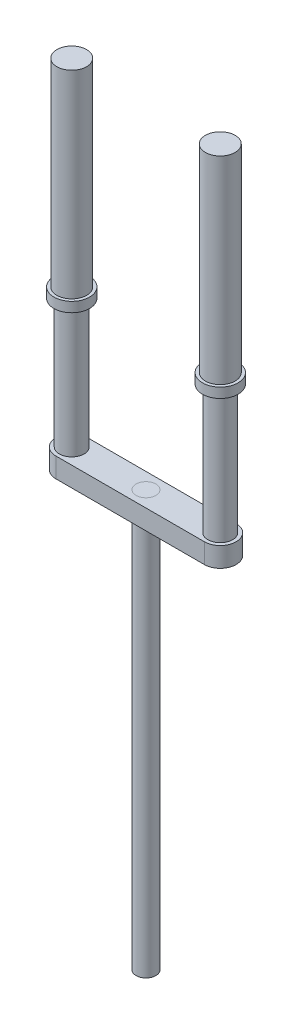
ISO-10303-21;
HEADER;
FILE_DESCRIPTION(('STEP AP214'),'2;1');
FILE_NAME('part.step','',(''),(''),'','','');
FILE_SCHEMA(('AUTOMOTIVE_DESIGN { 1 0 10303 214 1 1 1 1 }'));
ENDSEC;
DATA;
#1=APPLICATION_CONTEXT('core data for automotive mechanical design processes');
#2=APPLICATION_PROTOCOL_DEFINITION('international standard','automotive_design',2000,#1);
#3=PRODUCT_CONTEXT('',#1,'mechanical');
#4=PRODUCT('Part','Part','',(#3));
#5=PRODUCT_RELATED_PRODUCT_CATEGORY('part','',(#4));
#6=PRODUCT_DEFINITION_FORMATION('','',#4);
#7=PRODUCT_DEFINITION_CONTEXT('part definition',#1,'design');
#8=PRODUCT_DEFINITION('design','',#6,#7);
#9=PRODUCT_DEFINITION_SHAPE('','',#8);
#10=(LENGTH_UNIT() NAMED_UNIT(*) SI_UNIT(.MILLI.,.METRE.));
#11=(NAMED_UNIT(*) PLANE_ANGLE_UNIT() SI_UNIT($,.RADIAN.));
#12=(NAMED_UNIT(*) SI_UNIT($,.STERADIAN.) SOLID_ANGLE_UNIT());
#13=UNCERTAINTY_MEASURE_WITH_UNIT(LENGTH_MEASURE(1.E-05),#10,'distance_accuracy_value','');
#14=(GEOMETRIC_REPRESENTATION_CONTEXT(3) GLOBAL_UNCERTAINTY_ASSIGNED_CONTEXT((#13)) GLOBAL_UNIT_ASSIGNED_CONTEXT((#10,
#11,#12)) REPRESENTATION_CONTEXT('',''));
#15=CARTESIAN_POINT('',(0.,0.,0.));
#16=DIRECTION('',(0.,0.,1.));
#17=DIRECTION('',(1.,0.,0.));
#18=AXIS2_PLACEMENT_3D('',#15,#16,#17);
#19=CARTESIAN_POINT('',(0.,20.,0.));
#20=DIRECTION('',(0.,-1.,0.));
#21=DIRECTION('',(0.,0.,-1.));
#22=AXIS2_PLACEMENT_3D('',#19,#20,#21);
#23=CYLINDRICAL_SURFACE('',#22,10.);
#24=CARTESIAN_POINT('',(0.,20.,0.));
#25=DIRECTION('',(0.,1.,0.));
#26=DIRECTION('',(0.,0.,1.));
#27=AXIS2_PLACEMENT_3D('',#24,#25,#26);
#28=CIRCLE('',#27,10.);
#29=CARTESIAN_POINT('',(0.,20.,10.));
#30=VERTEX_POINT('',#29);
#31=EDGE_CURVE('E11',#30,#30,#28,.T.);
#32=ORIENTED_EDGE('',*,*,#31,.F.);
#33=EDGE_LOOP('',(#32));
#34=FACE_BOUND('',#33,.T.);
#35=CARTESIAN_POINT('',(0.,-400.,0.));
#36=DIRECTION('',(0.,1.,0.));
#37=DIRECTION('',(0.,0.,1.));
#38=AXIS2_PLACEMENT_3D('',#35,#36,#37);
#39=CIRCLE('',#38,10.);
#40=CARTESIAN_POINT('',(0.,-400.,10.));
#41=VERTEX_POINT('',#40);
#42=EDGE_CURVE('E55',#41,#41,#39,.T.);
#43=ORIENTED_EDGE('',*,*,#42,.T.);
#44=EDGE_LOOP('',(#43));
#45=FACE_BOUND('',#44,.T.);
#46=ADVANCED_FACE('F49',(#34,#45),#23,.T.);
#47=CARTESIAN_POINT('',(0.,20.,0.));
#48=DIRECTION('',(0.,1.,0.));
#49=DIRECTION('',(0.,0.,1.));
#50=AXIS2_PLACEMENT_3D('',#47,#48,#49);
#51=PLANE('',#50);
#52=ORIENTED_EDGE('',*,*,#31,.T.);
#53=EDGE_LOOP('',(#52));
#54=FACE_BOUND('',#53,.T.);
#55=ADVANCED_FACE('F64',(#54),#51,.T.);
#56=CARTESIAN_POINT('',(0.,-400.,0.));
#57=DIRECTION('',(0.,1.,0.));
#58=DIRECTION('',(0.,0.,1.));
#59=AXIS2_PLACEMENT_3D('',#56,#57,#58);
#60=PLANE('',#59);
#61=ORIENTED_EDGE('',*,*,#42,.F.);
#62=EDGE_LOOP('',(#61));
#63=FACE_BOUND('',#62,.T.);
#64=ADVANCED_FACE('F62',(#63),#60,.F.);
#65=CLOSED_SHELL('',(#46,#55,#64));
#66=MANIFOLD_SOLID_BREP('B2',#65);
#67=CARTESIAN_POINT('',(75.,360.,0.));
#68=DIRECTION('',(0.,-1.,0.));
#69=DIRECTION('',(0.,0.,-1.));
#70=AXIS2_PLACEMENT_3D('',#67,#68,#69);
#71=CYLINDRICAL_SURFACE('',#70,12.5);
#72=CARTESIAN_POINT('',(75.,20.,0.));
#73=DIRECTION('',(0.,1.,0.));
#74=DIRECTION('',(0.,0.,1.));
#75=AXIS2_PLACEMENT_3D('',#72,#73,#74);
#76=CIRCLE('',#75,12.5);
#77=CARTESIAN_POINT('',(75.,20.,-12.5));
#78=VERTEX_POINT('',#77);
#79=EDGE_CURVE('E196',#78,#78,#76,.T.);
#80=CARTESIAN_POINT('',(75.,150.,0.));
#81=DIRECTION('',(0.,1.,0.));
#82=DIRECTION('',(0.,0.,1.));
#83=AXIS2_PLACEMENT_3D('',#80,#81,#82);
#84=CIRCLE('',#83,12.5);
#85=CARTESIAN_POINT('',(75.,150.,-12.5));
#86=VERTEX_POINT('',#85);
#87=EDGE_CURVE('E47',#86,#86,#84,.T.);
#88=CARTESIAN_POINT('',(75.,20.,-12.5));
#89=CARTESIAN_POINT('',(75.,21.3541666666666,-12.5));
#90=CARTESIAN_POINT('',(75.,22.7083333333333,-12.5));
#91=CARTESIAN_POINT('',(75.,25.4166666666666,-12.5));
#92=CARTESIAN_POINT('',(75.,26.7708333333333,-12.5));
#93=CARTESIAN_POINT('',(75.,29.4791666666666,-12.5));
#94=CARTESIAN_POINT('',(75.,30.8333333333333,-12.5));
#95=CARTESIAN_POINT('',(75.,33.5416666666666,-12.5));
#96=CARTESIAN_POINT('',(75.,34.8958333333333,-12.5));
#97=CARTESIAN_POINT('',(75.,37.6041666666666,-12.5));
#98=CARTESIAN_POINT('',(75.,38.9583333333333,-12.5));
#99=CARTESIAN_POINT('',(75.,41.6666666666666,-12.5));
#100=CARTESIAN_POINT('',(75.,43.0208333333333,-12.5));
#101=CARTESIAN_POINT('',(75.,45.7291666666666,-12.5));
#102=CARTESIAN_POINT('',(75.,47.0833333333333,-12.5));
#103=CARTESIAN_POINT('',(75.,49.7916666666666,-12.5));
#104=CARTESIAN_POINT('',(75.,51.1458333333333,-12.5));
#105=CARTESIAN_POINT('',(75.,53.8541666666666,-12.5));
#106=CARTESIAN_POINT('',(75.,55.2083333333333,-12.5));
#107=CARTESIAN_POINT('',(75.,57.9166666666666,-12.5));
#108=CARTESIAN_POINT('',(75.,59.2708333333333,-12.5));
#109=CARTESIAN_POINT('',(75.,61.9791666666666,-12.5));
#110=CARTESIAN_POINT('',(75.,63.3333333333333,-12.5));
#111=CARTESIAN_POINT('',(75.,66.0416666666666,-12.5));
#112=CARTESIAN_POINT('',(75.,67.3958333333333,-12.5));
#113=CARTESIAN_POINT('',(75.,70.1041666666666,-12.5));
#114=CARTESIAN_POINT('',(75.,71.4583333333333,-12.5));
#115=CARTESIAN_POINT('',(75.,74.1666666666666,-12.5));
#116=CARTESIAN_POINT('',(75.,75.5208333333333,-12.5));
#117=CARTESIAN_POINT('',(75.,78.2291666666666,-12.5));
#118=CARTESIAN_POINT('',(75.,79.5833333333333,-12.5));
#119=CARTESIAN_POINT('',(75.,82.2916666666666,-12.5));
#120=CARTESIAN_POINT('',(75.,83.6458333333333,-12.5));
#121=CARTESIAN_POINT('',(75.,86.3541666666666,-12.5));
#122=CARTESIAN_POINT('',(75.,87.7083333333333,-12.5));
#123=CARTESIAN_POINT('',(75.,90.4166666666666,-12.5));
#124=CARTESIAN_POINT('',(75.,91.7708333333333,-12.5));
#125=CARTESIAN_POINT('',(75.,94.4791666666666,-12.5));
#126=CARTESIAN_POINT('',(75.,95.8333333333333,-12.5));
#127=CARTESIAN_POINT('',(75.,98.5416666666666,-12.5));
#128=CARTESIAN_POINT('',(75.,99.8958333333333,-12.5));
#129=CARTESIAN_POINT('',(75.,102.604166666667,-12.5));
#130=CARTESIAN_POINT('',(75.,103.958333333333,-12.5));
#131=CARTESIAN_POINT('',(75.,106.666666666667,-12.5));
#132=CARTESIAN_POINT('',(75.,108.020833333333,-12.5));
#133=CARTESIAN_POINT('',(75.,110.729166666667,-12.5));
#134=CARTESIAN_POINT('',(75.,112.083333333333,-12.5));
#135=CARTESIAN_POINT('',(75.,114.791666666667,-12.5));
#136=CARTESIAN_POINT('',(75.,116.145833333333,-12.5));
#137=CARTESIAN_POINT('',(75.,118.854166666667,-12.5));
#138=CARTESIAN_POINT('',(75.,120.208333333333,-12.5));
#139=CARTESIAN_POINT('',(75.,122.916666666667,-12.5));
#140=CARTESIAN_POINT('',(75.,124.270833333333,-12.5));
#141=CARTESIAN_POINT('',(75.,126.979166666667,-12.5));
#142=CARTESIAN_POINT('',(75.,128.333333333333,-12.5));
#143=CARTESIAN_POINT('',(75.,131.041666666667,-12.5));
#144=CARTESIAN_POINT('',(75.,132.395833333333,-12.5));
#145=CARTESIAN_POINT('',(75.,135.104166666667,-12.5));
#146=CARTESIAN_POINT('',(75.,136.458333333333,-12.5));
#147=CARTESIAN_POINT('',(75.,139.166666666667,-12.5));
#148=CARTESIAN_POINT('',(75.,140.520833333333,-12.5));
#149=CARTESIAN_POINT('',(75.,143.229166666667,-12.5));
#150=CARTESIAN_POINT('',(75.,144.583333333333,-12.5));
#151=CARTESIAN_POINT('',(75.,147.291666666667,-12.5));
#152=CARTESIAN_POINT('',(75.,148.645833333333,-12.5));
#153=CARTESIAN_POINT('',(75.,150.,-12.5));
#154=B_SPLINE_CURVE_WITH_KNOTS('',3,(#88,#89,#90,#91,#92,#93,#94,#95,#96,#97,#98,#99,#100,#101,
#102,#103,#104,#105,#106,#107,#108,#109,#110,#111,#112,#113,#114,#115,#116,#117,#118,#119,#120,
#121,#122,#123,#124,#125,#126,#127,#128,#129,#130,#131,#132,#133,#134,#135,#136,#137,#138,#139,
#140,#141,#142,#143,#144,#145,#146,#147,#148,#149,#150,#151,#152,#153),.UNSPECIFIED.,.F.,.F.,(4,
2,2,2,2,2,2,2,2,2,2,2,2,2,2,2,2,2,2,2,2,2,2,2,2,2,2,2,2,2,2,2,4),(0.,4.06250000000002,
8.12499999999999,12.1875,16.25,20.3125,24.375,28.4375,32.5,36.5625,40.625,44.6875,48.75,52.8125,
56.875,60.9375,65.,69.0625,73.125,77.1875,81.25,85.3125,89.375,93.4375,97.5,101.5625,105.625,
109.6875,113.75,117.8125,121.875,125.9375,130.),.UNSPECIFIED.);
#155=EDGE_CURVE('BSEAM90',#78,#86,#154,.T.);
#156=ORIENTED_EDGE('',*,*,#79,.T.);
#157=ORIENTED_EDGE('',*,*,#87,.F.);
#158=ORIENTED_EDGE('',*,*,#155,.T.);
#159=ORIENTED_EDGE('',*,*,#155,.F.);
#160=EDGE_LOOP('',(#156,#158,#157,#159));
#161=FACE_BOUND('',#160,.T.);
#162=ADVANCED_FACE('F90',(#161),#71,.T.);
#163=CARTESIAN_POINT('',(-75.,360.,0.));
#164=DIRECTION('',(0.,-1.,0.));
#165=DIRECTION('',(0.,0.,-1.));
#166=AXIS2_PLACEMENT_3D('',#163,#164,#165);
#167=CYLINDRICAL_SURFACE('',#166,12.5);
#168=CARTESIAN_POINT('',(-75.,150.,0.));
#169=DIRECTION('',(0.,-1.,0.));
#170=DIRECTION('',(0.,0.,-1.));
#171=AXIS2_PLACEMENT_3D('',#168,#169,#170);
#172=CIRCLE('',#171,12.5);
#173=CARTESIAN_POINT('',(-75.,150.,-12.5));
#174=VERTEX_POINT('',#173);
#175=EDGE_CURVE('E100',#174,#174,#172,.F.);
#176=CARTESIAN_POINT('',(-75.,20.,0.));
#177=DIRECTION('',(0.,1.,0.));
#178=DIRECTION('',(0.,0.,-1.));
#179=AXIS2_PLACEMENT_3D('',#176,#177,#178);
#180=CIRCLE('',#179,12.5);
#181=CARTESIAN_POINT('',(-75.,20.,-12.5));
#182=VERTEX_POINT('',#181);
#183=EDGE_CURVE('E193',#182,#182,#180,.T.);
#184=CARTESIAN_POINT('',(-75.,150.,-12.5));
#185=CARTESIAN_POINT('',(-75.,148.645833333333,-12.5));
#186=CARTESIAN_POINT('',(-75.,147.291666666667,-12.5));
#187=CARTESIAN_POINT('',(-75.,144.583333333333,-12.5));
#188=CARTESIAN_POINT('',(-75.,143.229166666667,-12.5));
#189=CARTESIAN_POINT('',(-75.,140.520833333333,-12.5));
#190=CARTESIAN_POINT('',(-75.,139.166666666667,-12.5));
#191=CARTESIAN_POINT('',(-75.,136.458333333333,-12.5));
#192=CARTESIAN_POINT('',(-75.,135.104166666667,-12.5));
#193=CARTESIAN_POINT('',(-75.,132.395833333333,-12.5));
#194=CARTESIAN_POINT('',(-75.,131.041666666667,-12.5));
#195=CARTESIAN_POINT('',(-75.,128.333333333333,-12.5));
#196=CARTESIAN_POINT('',(-75.,126.979166666667,-12.5));
#197=CARTESIAN_POINT('',(-75.,124.270833333333,-12.5));
#198=CARTESIAN_POINT('',(-75.,122.916666666667,-12.5));
#199=CARTESIAN_POINT('',(-75.,120.208333333333,-12.5));
#200=CARTESIAN_POINT('',(-75.,118.854166666667,-12.5));
#201=CARTESIAN_POINT('',(-75.,116.145833333333,-12.5));
#202=CARTESIAN_POINT('',(-75.,114.791666666667,-12.5));
#203=CARTESIAN_POINT('',(-75.,112.083333333333,-12.5));
#204=CARTESIAN_POINT('',(-75.,110.729166666667,-12.5));
#205=CARTESIAN_POINT('',(-75.,108.020833333333,-12.5));
#206=CARTESIAN_POINT('',(-75.,106.666666666667,-12.5));
#207=CARTESIAN_POINT('',(-75.,103.958333333333,-12.5));
#208=CARTESIAN_POINT('',(-75.,102.604166666667,-12.5));
#209=CARTESIAN_POINT('',(-75.,99.8958333333333,-12.5));
#210=CARTESIAN_POINT('',(-75.,98.5416666666667,-12.5));
#211=CARTESIAN_POINT('',(-75.,95.8333333333333,-12.5));
#212=CARTESIAN_POINT('',(-75.,94.4791666666667,-12.5));
#213=CARTESIAN_POINT('',(-75.,91.7708333333333,-12.5));
#214=CARTESIAN_POINT('',(-75.,90.4166666666667,-12.5));
#215=CARTESIAN_POINT('',(-75.,87.7083333333333,-12.5));
#216=CARTESIAN_POINT('',(-75.,86.3541666666667,-12.5));
#217=CARTESIAN_POINT('',(-75.,83.6458333333333,-12.5));
#218=CARTESIAN_POINT('',(-75.,82.2916666666667,-12.5));
#219=CARTESIAN_POINT('',(-75.,79.5833333333333,-12.5));
#220=CARTESIAN_POINT('',(-75.,78.2291666666666,-12.5));
#221=CARTESIAN_POINT('',(-75.,75.5208333333333,-12.5));
#222=CARTESIAN_POINT('',(-75.,74.1666666666667,-12.5));
#223=CARTESIAN_POINT('',(-75.,71.4583333333333,-12.5));
#224=CARTESIAN_POINT('',(-75.,70.1041666666666,-12.5));
#225=CARTESIAN_POINT('',(-75.,67.3958333333333,-12.5));
#226=CARTESIAN_POINT('',(-75.,66.0416666666666,-12.5));
#227=CARTESIAN_POINT('',(-75.,63.3333333333333,-12.5));
#228=CARTESIAN_POINT('',(-75.,61.9791666666666,-12.5));
#229=CARTESIAN_POINT('',(-75.,59.2708333333333,-12.5));
#230=CARTESIAN_POINT('',(-75.,57.9166666666666,-12.5));
#231=CARTESIAN_POINT('',(-75.,55.2083333333333,-12.5));
#232=CARTESIAN_POINT('',(-75.,53.8541666666667,-12.5));
#233=CARTESIAN_POINT('',(-75.,51.1458333333333,-12.5));
#234=CARTESIAN_POINT('',(-75.,49.7916666666666,-12.5));
#235=CARTESIAN_POINT('',(-75.,47.0833333333333,-12.5));
#236=CARTESIAN_POINT('',(-75.,45.7291666666667,-12.5));
#237=CARTESIAN_POINT('',(-75.,43.0208333333333,-12.5));
#238=CARTESIAN_POINT('',(-75.,41.6666666666667,-12.5));
#239=CARTESIAN_POINT('',(-75.,38.9583333333333,-12.5));
#240=CARTESIAN_POINT('',(-75.,37.6041666666666,-12.5));
#241=CARTESIAN_POINT('',(-75.,34.8958333333333,-12.5));
#242=CARTESIAN_POINT('',(-75.,33.5416666666666,-12.5));
#243=CARTESIAN_POINT('',(-75.,30.8333333333333,-12.5));
#244=CARTESIAN_POINT('',(-75.,29.4791666666666,-12.5));
#245=CARTESIAN_POINT('',(-75.,26.7708333333333,-12.5));
#246=CARTESIAN_POINT('',(-75.,25.4166666666666,-12.5));
#247=CARTESIAN_POINT('',(-75.,22.7083333333333,-12.5));
#248=CARTESIAN_POINT('',(-75.,21.3541666666666,-12.5));
#249=CARTESIAN_POINT('',(-75.,20.,-12.5));
#250=B_SPLINE_CURVE_WITH_KNOTS('',3,(#184,#185,#186,#187,#188,#189,#190,#191,#192,#193,#194,
#195,#196,#197,#198,#199,#200,#201,#202,#203,#204,#205,#206,#207,#208,#209,#210,#211,#212,#213,
#214,#215,#216,#217,#218,#219,#220,#221,#222,#223,#224,#225,#226,#227,#228,#229,#230,#231,#232,
#233,#234,#235,#236,#237,#238,#239,#240,#241,#242,#243,#244,#245,#246,#247,#248,#249),
.UNSPECIFIED.,.F.,.F.,(4,2,2,2,2,2,2,2,2,2,2,2,2,2,2,2,2,2,2,2,2,2,2,2,2,2,2,2,2,2,2,2,4),(0.,
4.0625,8.12499999999999,12.1875,16.25,20.3125,24.375,28.4375,32.5,36.5625,40.625,44.6875,48.75,
52.8125,56.875,60.9375,65.,69.0625,73.125,77.1875,81.25,85.3125,89.375,93.4375,97.5,101.5625,
105.625,109.6875,113.75,117.8125,121.875,125.9375,130.),.UNSPECIFIED.);
#251=EDGE_CURVE('BSEAM187',#174,#182,#250,.T.);
#252=ORIENTED_EDGE('',*,*,#175,.F.);
#253=ORIENTED_EDGE('',*,*,#183,.T.);
#254=ORIENTED_EDGE('',*,*,#251,.T.);
#255=ORIENTED_EDGE('',*,*,#251,.F.);
#256=EDGE_LOOP('',(#252,#254,#253,#255));
#257=FACE_BOUND('',#256,.T.);
#258=ADVANCED_FACE('F187',(#257),#167,.T.);
#259=CARTESIAN_POINT('',(-75.,20.,0.));
#260=DIRECTION('',(0.,-1.,0.));
#261=DIRECTION('',(0.,0.,-1.));
#262=AXIS2_PLACEMENT_3D('',#259,#260,#261);
#263=PLANE('',#262);
#264=CARTESIAN_POINT('',(-75.,20.,0.));
#265=DIRECTION('',(0.,1.,0.));
#266=DIRECTION('',(0.,0.,-1.));
#267=AXIS2_PLACEMENT_3D('',#264,#265,#266);
#268=CIRCLE('',#267,16.);
#269=CARTESIAN_POINT('',(-75.,20.,-16.));
#270=VERTEX_POINT('',#269);
#271=CARTESIAN_POINT('',(-75.,20.,16.));
#272=VERTEX_POINT('',#271);
#273=EDGE_CURVE('E145',#270,#272,#268,.T.);
#274=ORIENTED_EDGE('',*,*,#273,.T.);
#275=DIRECTION('',(1.,0.,0.));
#276=VECTOR('',#275,1.);
#277=CARTESIAN_POINT('',(-75.,20.,16.));
#278=LINE('',#277,#276);
#279=CARTESIAN_POINT('',(75.,20.,16.));
#280=VERTEX_POINT('',#279);
#281=EDGE_CURVE('E139',#272,#280,#278,.T.);
#282=ORIENTED_EDGE('',*,*,#281,.T.);
#283=CARTESIAN_POINT('',(75.,20.,0.));
#284=DIRECTION('',(0.,1.,0.));
#285=DIRECTION('',(0.,0.,1.));
#286=AXIS2_PLACEMENT_3D('',#283,#284,#285);
#287=CIRCLE('',#286,16.);
#288=CARTESIAN_POINT('',(75.,20.,-16.));
#289=VERTEX_POINT('',#288);
#290=EDGE_CURVE('E143',#280,#289,#287,.T.);
#291=ORIENTED_EDGE('',*,*,#290,.T.);
#292=DIRECTION('',(-1.,0.,0.));
#293=VECTOR('',#292,1.);
#294=CARTESIAN_POINT('',(-75.,20.,-16.));
#295=LINE('',#294,#293);
#296=EDGE_CURVE('E108',#289,#270,#295,.T.);
#297=ORIENTED_EDGE('',*,*,#296,.T.);
#298=EDGE_LOOP('',(#274,#282,#291,#297));
#299=FACE_BOUND('',#298,.T.);
#300=CARTESIAN_POINT('',(0.,20.,0.));
#301=DIRECTION('',(0.,1.,0.));
#302=DIRECTION('',(0.,0.,1.));
#303=AXIS2_PLACEMENT_3D('',#300,#301,#302);
#304=CIRCLE('',#303,10.);
#305=CARTESIAN_POINT('',(0.,20.,10.));
#306=VERTEX_POINT('',#305);
#307=EDGE_CURVE('E168',#306,#306,#304,.T.);
#308=ORIENTED_EDGE('',*,*,#307,.F.);
#309=EDGE_LOOP('',(#308));
#310=FACE_BOUND('',#309,.T.);
#311=ORIENTED_EDGE('',*,*,#79,.F.);
#312=EDGE_LOOP('',(#311));
#313=FACE_BOUND('',#312,.T.);
#314=ORIENTED_EDGE('',*,*,#183,.F.);
#315=EDGE_LOOP('',(#314));
#316=FACE_BOUND('',#315,.T.);
#317=ADVANCED_FACE('F140',(#299,#310,#313,#316),#263,.F.);
#318=CARTESIAN_POINT('',(-75.,0.,0.));
#319=DIRECTION('',(0.,-1.,0.));
#320=DIRECTION('',(0.,0.,-1.));
#321=AXIS2_PLACEMENT_3D('',#318,#319,#320);
#322=PLANE('',#321);
#323=CARTESIAN_POINT('',(-75.,0.,0.));
#324=DIRECTION('',(0.,1.,0.));
#325=DIRECTION('',(0.,0.,-1.));
#326=AXIS2_PLACEMENT_3D('',#323,#324,#325);
#327=CIRCLE('',#326,16.);
#328=CARTESIAN_POINT('',(-75.,0.,-16.));
#329=VERTEX_POINT('',#328);
#330=CARTESIAN_POINT('',(-75.,0.,16.));
#331=VERTEX_POINT('',#330);
#332=EDGE_CURVE('E164',#329,#331,#327,.T.);
#333=ORIENTED_EDGE('',*,*,#332,.F.);
#334=DIRECTION('',(-1.,0.,0.));
#335=VECTOR('',#334,1.);
#336=CARTESIAN_POINT('',(-75.,0.,-16.));
#337=LINE('',#336,#335);
#338=CARTESIAN_POINT('',(75.,0.,-16.));
#339=VERTEX_POINT('',#338);
#340=EDGE_CURVE('E131',#339,#329,#337,.T.);
#341=ORIENTED_EDGE('',*,*,#340,.F.);
#342=CARTESIAN_POINT('',(75.,0.,0.));
#343=DIRECTION('',(0.,1.,0.));
#344=DIRECTION('',(0.,0.,1.));
#345=AXIS2_PLACEMENT_3D('',#342,#343,#344);
#346=CIRCLE('',#345,16.);
#347=CARTESIAN_POINT('',(75.,0.,16.));
#348=VERTEX_POINT('',#347);
#349=EDGE_CURVE('E125',#348,#339,#346,.T.);
#350=ORIENTED_EDGE('',*,*,#349,.F.);
#351=DIRECTION('',(1.,0.,0.));
#352=VECTOR('',#351,1.);
#353=CARTESIAN_POINT('',(-75.,0.,16.));
#354=LINE('',#353,#352);
#355=EDGE_CURVE('E151',#331,#348,#354,.T.);
#356=ORIENTED_EDGE('',*,*,#355,.F.);
#357=EDGE_LOOP('',(#333,#341,#350,#356));
#358=FACE_BOUND('',#357,.T.);
#359=CARTESIAN_POINT('',(0.,0.,0.));
#360=DIRECTION('',(0.,1.,0.));
#361=DIRECTION('',(0.,0.,1.));
#362=AXIS2_PLACEMENT_3D('',#359,#360,#361);
#363=CIRCLE('',#362,10.);
#364=CARTESIAN_POINT('',(0.,0.,10.));
#365=VERTEX_POINT('',#364);
#366=EDGE_CURVE('E202',#365,#365,#363,.T.);
#367=ORIENTED_EDGE('',*,*,#366,.T.);
#368=EDGE_LOOP('',(#367));
#369=FACE_BOUND('',#368,.T.);
#370=ADVANCED_FACE('F217',(#358,#369),#322,.T.);
#371=CARTESIAN_POINT('',(-75.,20.,0.));
#372=DIRECTION('',(0.,-1.,0.));
#373=DIRECTION('',(0.,0.,-1.));
#374=AXIS2_PLACEMENT_3D('',#371,#372,#373);
#375=CYLINDRICAL_SURFACE('',#374,16.);
#376=ORIENTED_EDGE('',*,*,#332,.T.);
#377=DIRECTION('',(0.,-1.,0.));
#378=VECTOR('',#377,1.);
#379=CARTESIAN_POINT('',(-75.,20.,16.));
#380=LINE('',#379,#378);
#381=EDGE_CURVE('E153',#272,#331,#380,.T.);
#382=ORIENTED_EDGE('',*,*,#381,.F.);
#383=ORIENTED_EDGE('',*,*,#273,.F.);
#384=DIRECTION('',(0.,-1.,0.));
#385=VECTOR('',#384,1.);
#386=CARTESIAN_POINT('',(-75.,20.,-16.));
#387=LINE('',#386,#385);
#388=EDGE_CURVE('E160',#270,#329,#387,.T.);
#389=ORIENTED_EDGE('',*,*,#388,.T.);
#390=EDGE_LOOP('',(#376,#382,#383,#389));
#391=FACE_BOUND('',#390,.T.);
#392=ADVANCED_FACE('F92',(#391),#375,.T.);
#393=CARTESIAN_POINT('',(-75.,20.,16.));
#394=DIRECTION('',(0.,0.,-1.));
#395=DIRECTION('',(-1.,0.,0.));
#396=AXIS2_PLACEMENT_3D('',#393,#394,#395);
#397=PLANE('',#396);
#398=ORIENTED_EDGE('',*,*,#355,.T.);
#399=DIRECTION('',(0.,-1.,0.));
#400=VECTOR('',#399,1.);
#401=CARTESIAN_POINT('',(75.,20.,16.));
#402=LINE('',#401,#400);
#403=EDGE_CURVE('E149',#280,#348,#402,.T.);
#404=ORIENTED_EDGE('',*,*,#403,.F.);
#405=ORIENTED_EDGE('',*,*,#281,.F.);
#406=ORIENTED_EDGE('',*,*,#381,.T.);
#407=EDGE_LOOP('',(#398,#404,#405,#406));
#408=FACE_BOUND('',#407,.T.);
#409=ADVANCED_FACE('F150',(#408),#397,.F.);
#410=CARTESIAN_POINT('',(75.,20.,0.));
#411=DIRECTION('',(0.,-1.,0.));
#412=DIRECTION('',(0.,0.,-1.));
#413=AXIS2_PLACEMENT_3D('',#410,#411,#412);
#414=CYLINDRICAL_SURFACE('',#413,16.);
#415=ORIENTED_EDGE('',*,*,#349,.T.);
#416=DIRECTION('',(0.,-1.,0.));
#417=VECTOR('',#416,1.);
#418=CARTESIAN_POINT('',(75.,20.,-16.));
#419=LINE('',#418,#417);
#420=EDGE_CURVE('E154',#289,#339,#419,.T.);
#421=ORIENTED_EDGE('',*,*,#420,.F.);
#422=ORIENTED_EDGE('',*,*,#290,.F.);
#423=ORIENTED_EDGE('',*,*,#403,.T.);
#424=EDGE_LOOP('',(#415,#421,#422,#423));
#425=FACE_BOUND('',#424,.T.);
#426=ADVANCED_FACE('F156',(#425),#414,.T.);
#427=CARTESIAN_POINT('',(-75.,20.,-16.));
#428=DIRECTION('',(0.,0.,1.));
#429=DIRECTION('',(1.,0.,0.));
#430=AXIS2_PLACEMENT_3D('',#427,#428,#429);
#431=PLANE('',#430);
#432=ORIENTED_EDGE('',*,*,#340,.T.);
#433=ORIENTED_EDGE('',*,*,#388,.F.);
#434=ORIENTED_EDGE('',*,*,#296,.F.);
#435=ORIENTED_EDGE('',*,*,#420,.T.);
#436=EDGE_LOOP('',(#432,#433,#434,#435));
#437=FACE_BOUND('',#436,.T.);
#438=ADVANCED_FACE('F222',(#437),#431,.F.);
#439=CARTESIAN_POINT('',(0.,20.,0.));
#440=DIRECTION('',(0.,-1.,0.));
#441=DIRECTION('',(0.,0.,-1.));
#442=AXIS2_PLACEMENT_3D('',#439,#440,#441);
#443=CYLINDRICAL_SURFACE('',#442,10.);
#444=ORIENTED_EDGE('',*,*,#307,.T.);
#445=EDGE_LOOP('',(#444));
#446=FACE_BOUND('',#445,.T.);
#447=ORIENTED_EDGE('',*,*,#366,.F.);
#448=EDGE_LOOP('',(#447));
#449=FACE_BOUND('',#448,.T.);
#450=ADVANCED_FACE('F219',(#446,#449),#443,.F.);
#451=CARTESIAN_POINT('',(-75.,150.,0.));
#452=DIRECTION('',(0.,1.,0.));
#453=DIRECTION('',(0.,0.,1.));
#454=AXIS2_PLACEMENT_3D('',#451,#452,#453);
#455=CYLINDRICAL_SURFACE('',#454,18.);
#456=CARTESIAN_POINT('',(-75.,150.,0.));
#457=DIRECTION('',(0.,-1.,0.));
#458=DIRECTION('',(0.,0.,-1.));
#459=AXIS2_PLACEMENT_3D('',#456,#457,#458);
#460=CIRCLE('',#459,18.);
#461=CARTESIAN_POINT('',(-75.,150.,-18.));
#462=VERTEX_POINT('',#461);
#463=EDGE_CURVE('E263',#462,#462,#460,.T.);
#464=ORIENTED_EDGE('',*,*,#463,.F.);
#465=EDGE_LOOP('',(#464));
#466=FACE_BOUND('',#465,.T.);
#467=CARTESIAN_POINT('',(-75.,160.,0.));
#468=DIRECTION('',(0.,-1.,0.));
#469=DIRECTION('',(0.,0.,-1.));
#470=AXIS2_PLACEMENT_3D('',#467,#468,#469);
#471=CIRCLE('',#470,18.);
#472=CARTESIAN_POINT('',(-75.,160.,-18.));
#473=VERTEX_POINT('',#472);
#474=EDGE_CURVE('E269',#473,#473,#471,.T.);
#475=ORIENTED_EDGE('',*,*,#474,.T.);
#476=EDGE_LOOP('',(#475));
#477=FACE_BOUND('',#476,.T.);
#478=ADVANCED_FACE('F221',(#466,#477),#455,.T.);
#479=CARTESIAN_POINT('',(-75.,150.,0.));
#480=DIRECTION('',(0.,-1.,0.));
#481=DIRECTION('',(0.,0.,-1.));
#482=AXIS2_PLACEMENT_3D('',#479,#480,#481);
#483=PLANE('',#482);
#484=ORIENTED_EDGE('',*,*,#175,.T.);
#485=EDGE_LOOP('',(#484));
#486=FACE_BOUND('',#485,.T.);
#487=ORIENTED_EDGE('',*,*,#463,.T.);
#488=EDGE_LOOP('',(#487));
#489=FACE_BOUND('',#488,.T.);
#490=ADVANCED_FACE('F184',(#486,#489),#483,.T.);
#491=CARTESIAN_POINT('',(-75.,160.,0.));
#492=DIRECTION('',(0.,-1.,0.));
#493=DIRECTION('',(0.,0.,-1.));
#494=AXIS2_PLACEMENT_3D('',#491,#492,#493);
#495=PLANE('',#494);
#496=CARTESIAN_POINT('',(-75.,160.,0.));
#497=DIRECTION('',(0.,1.,0.));
#498=DIRECTION('',(0.,0.,1.));
#499=AXIS2_PLACEMENT_3D('',#496,#497,#498);
#500=CIRCLE('',#499,15.);
#501=CARTESIAN_POINT('',(-75.,160.,15.));
#502=VERTEX_POINT('',#501);
#503=EDGE_CURVE('E197',#502,#502,#500,.F.);
#504=ORIENTED_EDGE('',*,*,#503,.T.);
#505=EDGE_LOOP('',(#504));
#506=FACE_BOUND('',#505,.T.);
#507=ORIENTED_EDGE('',*,*,#474,.F.);
#508=EDGE_LOOP('',(#507));
#509=FACE_BOUND('',#508,.T.);
#510=ADVANCED_FACE('F246',(#506,#509),#495,.F.);
#511=CARTESIAN_POINT('',(0.,360.,0.));
#512=DIRECTION('',(0.,1.,0.));
#513=DIRECTION('',(0.,0.,1.));
#514=AXIS2_PLACEMENT_3D('',#511,#512,#513);
#515=PLANE('',#514);
#516=CARTESIAN_POINT('',(-75.,360.,0.));
#517=DIRECTION('',(0.,1.,0.));
#518=DIRECTION('',(0.,0.,1.));
#519=AXIS2_PLACEMENT_3D('',#516,#517,#518);
#520=CIRCLE('',#519,15.);
#521=CARTESIAN_POINT('',(-75.,360.,15.));
#522=VERTEX_POINT('',#521);
#523=EDGE_CURVE('E205',#522,#522,#520,.F.);
#524=ORIENTED_EDGE('',*,*,#523,.F.);
#525=EDGE_LOOP('',(#524));
#526=FACE_BOUND('',#525,.T.);
#527=ADVANCED_FACE('F243',(#526),#515,.T.);
#528=CARTESIAN_POINT('',(-75.,160.,0.));
#529=DIRECTION('',(0.,1.,0.));
#530=DIRECTION('',(0.,0.,1.));
#531=AXIS2_PLACEMENT_3D('',#528,#529,#530);
#532=CYLINDRICAL_SURFACE('',#531,15.);
#533=ORIENTED_EDGE('',*,*,#503,.F.);
#534=EDGE_LOOP('',(#533));
#535=FACE_BOUND('',#534,.T.);
#536=ORIENTED_EDGE('',*,*,#523,.T.);
#537=EDGE_LOOP('',(#536));
#538=FACE_BOUND('',#537,.T.);
#539=ADVANCED_FACE('F245',(#535,#538),#532,.T.);
#540=CARTESIAN_POINT('',(75.,150.,0.));
#541=DIRECTION('',(0.,1.,0.));
#542=DIRECTION('',(0.,0.,1.));
#543=AXIS2_PLACEMENT_3D('',#540,#541,#542);
#544=CYLINDRICAL_SURFACE('',#543,18.);
#545=CARTESIAN_POINT('',(75.,150.,0.));
#546=DIRECTION('',(0.,-1.,0.));
#547=DIRECTION('',(0.,0.,1.));
#548=AXIS2_PLACEMENT_3D('',#545,#546,#547);
#549=CIRCLE('',#548,18.);
#550=CARTESIAN_POINT('',(75.,150.,18.));
#551=VERTEX_POINT('',#550);
#552=EDGE_CURVE('E279',#551,#551,#549,.T.);
#553=ORIENTED_EDGE('',*,*,#552,.F.);
#554=EDGE_LOOP('',(#553));
#555=FACE_BOUND('',#554,.T.);
#556=CARTESIAN_POINT('',(75.,160.,0.));
#557=DIRECTION('',(0.,-1.,0.));
#558=DIRECTION('',(0.,0.,1.));
#559=AXIS2_PLACEMENT_3D('',#556,#557,#558);
#560=CIRCLE('',#559,18.);
#561=CARTESIAN_POINT('',(75.,160.,18.));
#562=VERTEX_POINT('',#561);
#563=EDGE_CURVE('E280',#562,#562,#560,.T.);
#564=ORIENTED_EDGE('',*,*,#563,.T.);
#565=EDGE_LOOP('',(#564));
#566=FACE_BOUND('',#565,.T.);
#567=ADVANCED_FACE('F252',(#555,#566),#544,.T.);
#568=CARTESIAN_POINT('',(75.,150.,0.));
#569=DIRECTION('',(0.,1.,0.));
#570=DIRECTION('',(0.,0.,1.));
#571=AXIS2_PLACEMENT_3D('',#568,#569,#570);
#572=PLANE('',#571);
#573=ORIENTED_EDGE('',*,*,#87,.T.);
#574=EDGE_LOOP('',(#573));
#575=FACE_BOUND('',#574,.T.);
#576=ORIENTED_EDGE('',*,*,#552,.T.);
#577=EDGE_LOOP('',(#576));
#578=FACE_BOUND('',#577,.T.);
#579=ADVANCED_FACE('F288',(#575,#578),#572,.F.);
#580=CARTESIAN_POINT('',(75.,160.,0.));
#581=DIRECTION('',(0.,1.,0.));
#582=DIRECTION('',(0.,0.,1.));
#583=AXIS2_PLACEMENT_3D('',#580,#581,#582);
#584=PLANE('',#583);
#585=CARTESIAN_POINT('',(75.,160.,0.));
#586=DIRECTION('',(0.,1.,0.));
#587=DIRECTION('',(0.,0.,1.));
#588=AXIS2_PLACEMENT_3D('',#585,#586,#587);
#589=CIRCLE('',#588,15.);
#590=CARTESIAN_POINT('',(75.,160.,15.));
#591=VERTEX_POINT('',#590);
#592=EDGE_CURVE('E274',#591,#591,#589,.F.);
#593=ORIENTED_EDGE('',*,*,#592,.T.);
#594=EDGE_LOOP('',(#593));
#595=FACE_BOUND('',#594,.T.);
#596=ORIENTED_EDGE('',*,*,#563,.F.);
#597=EDGE_LOOP('',(#596));
#598=FACE_BOUND('',#597,.T.);
#599=ADVANCED_FACE('F295',(#595,#598),#584,.T.);
#600=CARTESIAN_POINT('',(0.,360.,0.));
#601=DIRECTION('',(0.,1.,0.));
#602=DIRECTION('',(0.,0.,1.));
#603=AXIS2_PLACEMENT_3D('',#600,#601,#602);
#604=PLANE('',#603);
#605=CARTESIAN_POINT('',(75.,360.,0.));
#606=DIRECTION('',(0.,1.,0.));
#607=DIRECTION('',(0.,0.,1.));
#608=AXIS2_PLACEMENT_3D('',#605,#606,#607);
#609=CIRCLE('',#608,15.);
#610=CARTESIAN_POINT('',(75.,360.,15.));
#611=VERTEX_POINT('',#610);
#612=EDGE_CURVE('E260',#611,#611,#609,.T.);
#613=ORIENTED_EDGE('',*,*,#612,.T.);
#614=EDGE_LOOP('',(#613));
#615=FACE_BOUND('',#614,.T.);
#616=ADVANCED_FACE('F241',(#615),#604,.T.);
#617=CARTESIAN_POINT('',(75.,160.,0.));
#618=DIRECTION('',(0.,1.,0.));
#619=DIRECTION('',(0.,0.,1.));
#620=AXIS2_PLACEMENT_3D('',#617,#618,#619);
#621=CYLINDRICAL_SURFACE('',#620,15.);
#622=ORIENTED_EDGE('',*,*,#592,.F.);
#623=EDGE_LOOP('',(#622));
#624=FACE_BOUND('',#623,.T.);
#625=ORIENTED_EDGE('',*,*,#612,.F.);
#626=EDGE_LOOP('',(#625));
#627=FACE_BOUND('',#626,.T.);
#628=ADVANCED_FACE('F303',(#624,#627),#621,.T.);
#629=CLOSED_SHELL('',(#162,#258,#317,#370,#392,#409,#426,#438,#450,#478,#490,#510,#527,#539,
#567,#579,#599,#616,#628));
#630=MANIFOLD_SOLID_BREP('B6',#629);
#631=ADVANCED_BREP_SHAPE_REPRESENTATION('',(#18,#66,#630),#14);
#632=SHAPE_DEFINITION_REPRESENTATION(#9,#631);
ENDSEC;
END-ISO-10303-21;
